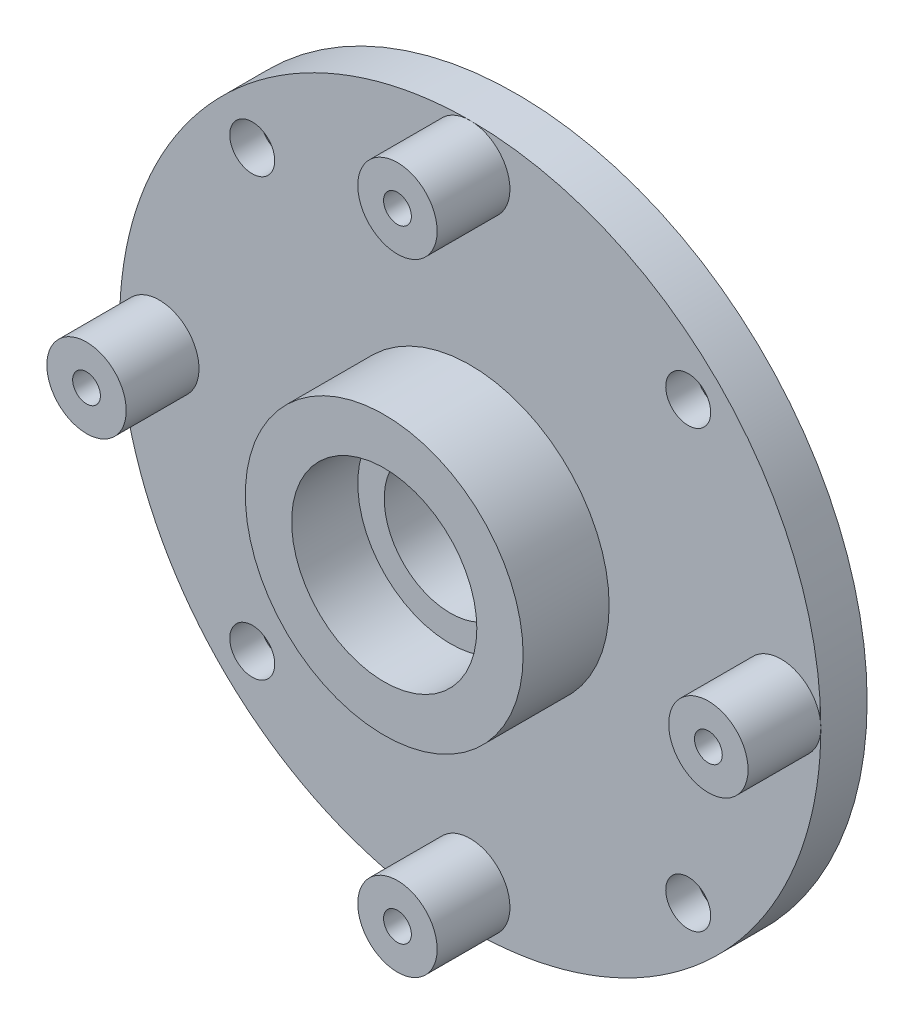
ISO-10303-21;
HEADER;
FILE_DESCRIPTION(('STEP AP214'),'2;1');
FILE_NAME('part.step','',(''),(''),'','','');
FILE_SCHEMA(('AUTOMOTIVE_DESIGN { 1 0 10303 214 1 1 1 1 }'));
ENDSEC;
DATA;
#1=APPLICATION_CONTEXT('core data for automotive mechanical design processes');
#2=APPLICATION_PROTOCOL_DEFINITION('international standard','automotive_design',2000,#1);
#3=PRODUCT_CONTEXT('',#1,'mechanical');
#4=PRODUCT('Part','Part','',(#3));
#5=PRODUCT_RELATED_PRODUCT_CATEGORY('part','',(#4));
#6=PRODUCT_DEFINITION_FORMATION('','',#4);
#7=PRODUCT_DEFINITION_CONTEXT('part definition',#1,'design');
#8=PRODUCT_DEFINITION('design','',#6,#7);
#9=PRODUCT_DEFINITION_SHAPE('','',#8);
#10=(LENGTH_UNIT() NAMED_UNIT(*) SI_UNIT(.MILLI.,.METRE.));
#11=(NAMED_UNIT(*) PLANE_ANGLE_UNIT() SI_UNIT($,.RADIAN.));
#12=(NAMED_UNIT(*) SI_UNIT($,.STERADIAN.) SOLID_ANGLE_UNIT());
#13=UNCERTAINTY_MEASURE_WITH_UNIT(LENGTH_MEASURE(1.E-05),#10,'distance_accuracy_value','');
#14=(GEOMETRIC_REPRESENTATION_CONTEXT(3) GLOBAL_UNCERTAINTY_ASSIGNED_CONTEXT((#13)) GLOBAL_UNIT_ASSIGNED_CONTEXT((#10,
#11,#12)) REPRESENTATION_CONTEXT('',''));
#15=CARTESIAN_POINT('',(0.,0.,0.));
#16=DIRECTION('',(0.,0.,1.));
#17=DIRECTION('',(1.,0.,0.));
#18=AXIS2_PLACEMENT_3D('',#15,#16,#17);
#19=CARTESIAN_POINT('',(0.,0.,-36.7));
#20=DIRECTION('',(0.,0.,-1.));
#21=DIRECTION('',(-1.,0.,0.));
#22=AXIS2_PLACEMENT_3D('',#19,#20,#21);
#23=CYLINDRICAL_SURFACE('',#22,26.5);
#24=CARTESIAN_POINT('',(0.,0.,-36.7));
#25=DIRECTION('',(0.,0.,1.));
#26=DIRECTION('',(1.,0.,0.));
#27=AXIS2_PLACEMENT_3D('',#24,#25,#26);
#28=CIRCLE('',#27,26.5);
#29=CARTESIAN_POINT('',(26.5,0.,-36.7));
#30=VERTEX_POINT('',#29);
#31=CARTESIAN_POINT('',(0.,26.5,-36.7));
#32=VERTEX_POINT('',#31);
#33=EDGE_CURVE('E49',#30,#32,#28,.T.);
#34=ORIENTED_EDGE('',*,*,#33,.F.);
#35=CARTESIAN_POINT('',(0.,-26.5,-36.7));
#36=VERTEX_POINT('',#35);
#37=EDGE_CURVE('E69',#36,#30,#28,.T.);
#38=ORIENTED_EDGE('',*,*,#37,.F.);
#39=CARTESIAN_POINT('',(-26.5,0.,-36.7));
#40=VERTEX_POINT('',#39);
#41=EDGE_CURVE('E78',#40,#36,#28,.T.);
#42=ORIENTED_EDGE('',*,*,#41,.F.);
#43=EDGE_CURVE('E131',#32,#40,#28,.T.);
#44=ORIENTED_EDGE('',*,*,#43,.F.);
#45=EDGE_LOOP('',(#34,#38,#42,#44));
#46=FACE_BOUND('',#45,.T.);
#47=CARTESIAN_POINT('',(0.,0.,-40.2));
#48=DIRECTION('',(0.,0.,1.));
#49=DIRECTION('',(1.,0.,0.));
#50=AXIS2_PLACEMENT_3D('',#47,#48,#49);
#51=CIRCLE('',#50,26.5);
#52=CARTESIAN_POINT('',(26.5,0.,-40.2));
#53=VERTEX_POINT('',#52);
#54=EDGE_CURVE('E79',#53,#53,#51,.T.);
#55=ORIENTED_EDGE('',*,*,#54,.T.);
#56=EDGE_LOOP('',(#55));
#57=FACE_BOUND('',#56,.T.);
#58=ADVANCED_FACE('F41',(#46,#57),#23,.T.);
#59=CARTESIAN_POINT('',(0.,0.,-36.7));
#60=DIRECTION('',(0.,0.,1.));
#61=DIRECTION('',(1.,0.,0.));
#62=AXIS2_PLACEMENT_3D('',#59,#60,#61);
#63=PLANE('',#62);
#64=CARTESIAN_POINT('',(16.4755880016466,-16.4755880016466,-36.7));
#65=DIRECTION('',(0.,0.,1.));
#66=DIRECTION('',(1.,0.,0.));
#67=AXIS2_PLACEMENT_3D('',#64,#65,#66);
#68=CIRCLE('',#67,1.7);
#69=CARTESIAN_POINT('',(18.1755880016466,-16.4755880016466,-36.7));
#70=VERTEX_POINT('',#69);
#71=EDGE_CURVE('E96',#70,#70,#68,.F.);
#72=ORIENTED_EDGE('',*,*,#71,.T.);
#73=EDGE_LOOP('',(#72));
#74=FACE_BOUND('',#73,.T.);
#75=CARTESIAN_POINT('',(-16.4755880016466,-16.4755880016466,-36.7));
#76=DIRECTION('',(0.,0.,1.));
#77=DIRECTION('',(1.,0.,0.));
#78=AXIS2_PLACEMENT_3D('',#75,#76,#77);
#79=CIRCLE('',#78,1.7);
#80=CARTESIAN_POINT('',(-14.7755880016466,-16.4755880016466,-36.7));
#81=VERTEX_POINT('',#80);
#82=EDGE_CURVE('E103',#81,#81,#79,.F.);
#83=ORIENTED_EDGE('',*,*,#82,.T.);
#84=EDGE_LOOP('',(#83));
#85=FACE_BOUND('',#84,.T.);
#86=CARTESIAN_POINT('',(-16.4755880016466,16.4755880016466,-36.7));
#87=DIRECTION('',(0.,0.,1.));
#88=DIRECTION('',(1.,0.,0.));
#89=AXIS2_PLACEMENT_3D('',#86,#87,#88);
#90=CIRCLE('',#89,1.7);
#91=CARTESIAN_POINT('',(-14.7755880016466,16.4755880016466,-36.7));
#92=VERTEX_POINT('',#91);
#93=EDGE_CURVE('E110',#92,#92,#90,.F.);
#94=ORIENTED_EDGE('',*,*,#93,.T.);
#95=EDGE_LOOP('',(#94));
#96=FACE_BOUND('',#95,.T.);
#97=CARTESIAN_POINT('',(16.4755880016469,16.4755880016469,-36.7));
#98=DIRECTION('',(0.,0.,1.));
#99=DIRECTION('',(1.,0.,0.));
#100=AXIS2_PLACEMENT_3D('',#97,#98,#99);
#101=CIRCLE('',#100,1.7);
#102=CARTESIAN_POINT('',(18.1755880016469,16.4755880016469,-36.7));
#103=VERTEX_POINT('',#102);
#104=EDGE_CURVE('E117',#103,#103,#101,.F.);
#105=ORIENTED_EDGE('',*,*,#104,.T.);
#106=EDGE_LOOP('',(#105));
#107=FACE_BOUND('',#106,.T.);
#108=CARTESIAN_POINT('',(0.,0.,-36.7));
#109=DIRECTION('',(0.,0.,1.));
#110=DIRECTION('',(1.,0.,0.));
#111=AXIS2_PLACEMENT_3D('',#108,#109,#110);
#112=CIRCLE('',#111,10.5);
#113=CARTESIAN_POINT('',(10.5,0.,-36.7));
#114=VERTEX_POINT('',#113);
#115=EDGE_CURVE('E11',#114,#114,#112,.T.);
#116=ORIENTED_EDGE('',*,*,#115,.F.);
#117=EDGE_LOOP('',(#116));
#118=FACE_BOUND('',#117,.T.);
#119=ORIENTED_EDGE('',*,*,#41,.T.);
#120=CARTESIAN_POINT('',(0.,-23.5,-36.7));
#121=DIRECTION('',(0.,0.,1.));
#122=DIRECTION('',(1.,0.,0.));
#123=AXIS2_PLACEMENT_3D('',#120,#121,#122);
#124=CIRCLE('',#123,3.);
#125=EDGE_CURVE('E55',#36,#36,#124,.T.);
#126=ORIENTED_EDGE('',*,*,#125,.F.);
#127=ORIENTED_EDGE('',*,*,#37,.T.);
#128=CARTESIAN_POINT('',(23.5,0.,-36.7));
#129=DIRECTION('',(0.,0.,1.));
#130=DIRECTION('',(1.,0.,0.));
#131=AXIS2_PLACEMENT_3D('',#128,#129,#130);
#132=CIRCLE('',#131,3.);
#133=EDGE_CURVE('E74',#30,#30,#132,.T.);
#134=ORIENTED_EDGE('',*,*,#133,.F.);
#135=ORIENTED_EDGE('',*,*,#33,.T.);
#136=CARTESIAN_POINT('',(0.,23.5,-36.7));
#137=DIRECTION('',(0.,0.,1.));
#138=DIRECTION('',(1.,0.,0.));
#139=AXIS2_PLACEMENT_3D('',#136,#137,#138);
#140=CIRCLE('',#139,3.);
#141=EDGE_CURVE('E174',#32,#32,#140,.T.);
#142=ORIENTED_EDGE('',*,*,#141,.F.);
#143=ORIENTED_EDGE('',*,*,#43,.T.);
#144=CARTESIAN_POINT('',(-23.5,0.,-36.7));
#145=DIRECTION('',(0.,0.,1.));
#146=DIRECTION('',(1.,0.,0.));
#147=AXIS2_PLACEMENT_3D('',#144,#145,#146);
#148=CIRCLE('',#147,3.);
#149=EDGE_CURVE('E60',#40,#40,#148,.T.);
#150=ORIENTED_EDGE('',*,*,#149,.F.);
#151=EDGE_LOOP('',(#119,#126,#127,#134,#135,#142,#143,#150));
#152=FACE_BOUND('',#151,.T.);
#153=ADVANCED_FACE('F72',(#74,#85,#96,#107,#118,#152),#63,.T.);
#154=CARTESIAN_POINT('',(0.,0.,-40.2));
#155=DIRECTION('',(0.,0.,1.));
#156=DIRECTION('',(1.,0.,0.));
#157=AXIS2_PLACEMENT_3D('',#154,#155,#156);
#158=PLANE('',#157);
#159=CARTESIAN_POINT('',(0.,-23.5,-40.2));
#160=DIRECTION('',(0.,0.,1.));
#161=DIRECTION('',(1.,0.,0.));
#162=AXIS2_PLACEMENT_3D('',#159,#160,#161);
#163=CIRCLE('',#162,1.05);
#164=CARTESIAN_POINT('',(1.05,-23.5,-40.2));
#165=VERTEX_POINT('',#164);
#166=EDGE_CURVE('E165',#165,#165,#163,.F.);
#167=ORIENTED_EDGE('',*,*,#166,.F.);
#168=EDGE_LOOP('',(#167));
#169=FACE_BOUND('',#168,.T.);
#170=CARTESIAN_POINT('',(-23.5,0.,-40.2));
#171=DIRECTION('',(0.,0.,1.));
#172=DIRECTION('',(1.,0.,0.));
#173=AXIS2_PLACEMENT_3D('',#170,#171,#172);
#174=CIRCLE('',#173,1.05);
#175=CARTESIAN_POINT('',(-22.45,0.,-40.2));
#176=VERTEX_POINT('',#175);
#177=EDGE_CURVE('E155',#176,#176,#174,.F.);
#178=ORIENTED_EDGE('',*,*,#177,.F.);
#179=EDGE_LOOP('',(#178));
#180=FACE_BOUND('',#179,.T.);
#181=CARTESIAN_POINT('',(0.,23.5,-40.2));
#182=DIRECTION('',(0.,0.,1.));
#183=DIRECTION('',(1.,0.,0.));
#184=AXIS2_PLACEMENT_3D('',#181,#182,#183);
#185=CIRCLE('',#184,1.05);
#186=CARTESIAN_POINT('',(1.05,23.5,-40.2));
#187=VERTEX_POINT('',#186);
#188=EDGE_CURVE('E151',#187,#187,#185,.F.);
#189=ORIENTED_EDGE('',*,*,#188,.F.);
#190=EDGE_LOOP('',(#189));
#191=FACE_BOUND('',#190,.T.);
#192=CARTESIAN_POINT('',(23.5,0.,-40.2));
#193=DIRECTION('',(0.,0.,1.));
#194=DIRECTION('',(1.,0.,0.));
#195=AXIS2_PLACEMENT_3D('',#192,#193,#194);
#196=CIRCLE('',#195,1.05);
#197=CARTESIAN_POINT('',(24.55,0.,-40.2));
#198=VERTEX_POINT('',#197);
#199=EDGE_CURVE('E84',#198,#198,#196,.F.);
#200=ORIENTED_EDGE('',*,*,#199,.F.);
#201=EDGE_LOOP('',(#200));
#202=FACE_BOUND('',#201,.T.);
#203=CARTESIAN_POINT('',(16.4755880016469,-16.4755880016469,-40.2));
#204=DIRECTION('',(0.,0.,-1.));
#205=DIRECTION('',(0.,1.,0.));
#206=AXIS2_PLACEMENT_3D('',#203,#204,#205);
#207=CIRCLE('',#206,2.8);
#208=CARTESIAN_POINT('',(16.4755880016469,-13.6755880016469,-40.2));
#209=VERTEX_POINT('',#208);
#210=EDGE_CURVE('E87',#209,#209,#207,.T.);
#211=ORIENTED_EDGE('',*,*,#210,.F.);
#212=EDGE_LOOP('',(#211));
#213=FACE_BOUND('',#212,.T.);
#214=CARTESIAN_POINT('',(-16.4755880016469,-16.4755880016469,-40.2));
#215=DIRECTION('',(0.,0.,-1.));
#216=DIRECTION('',(0.,1.,0.));
#217=AXIS2_PLACEMENT_3D('',#214,#215,#216);
#218=CIRCLE('',#217,2.8);
#219=CARTESIAN_POINT('',(-16.4755880016469,-13.6755880016469,-40.2));
#220=VERTEX_POINT('',#219);
#221=EDGE_CURVE('E99',#220,#220,#218,.T.);
#222=ORIENTED_EDGE('',*,*,#221,.F.);
#223=EDGE_LOOP('',(#222));
#224=FACE_BOUND('',#223,.T.);
#225=CARTESIAN_POINT('',(-16.4755880016469,16.4755880016469,-40.2));
#226=DIRECTION('',(0.,0.,-1.));
#227=DIRECTION('',(0.,1.,0.));
#228=AXIS2_PLACEMENT_3D('',#225,#226,#227);
#229=CIRCLE('',#228,2.8);
#230=CARTESIAN_POINT('',(-16.4755880016469,19.2755880016469,-40.2));
#231=VERTEX_POINT('',#230);
#232=EDGE_CURVE('E106',#231,#231,#229,.T.);
#233=ORIENTED_EDGE('',*,*,#232,.F.);
#234=EDGE_LOOP('',(#233));
#235=FACE_BOUND('',#234,.T.);
#236=CARTESIAN_POINT('',(16.4755880016469,16.4755880016469,-40.2));
#237=DIRECTION('',(0.,0.,-1.));
#238=DIRECTION('',(0.,1.,0.));
#239=AXIS2_PLACEMENT_3D('',#236,#237,#238);
#240=CIRCLE('',#239,2.8);
#241=CARTESIAN_POINT('',(16.4755880016469,19.2755880016469,-40.2));
#242=VERTEX_POINT('',#241);
#243=EDGE_CURVE('E113',#242,#242,#240,.T.);
#244=ORIENTED_EDGE('',*,*,#243,.F.);
#245=EDGE_LOOP('',(#244));
#246=FACE_BOUND('',#245,.T.);
#247=CARTESIAN_POINT('',(0.,0.,-40.2));
#248=DIRECTION('',(0.,0.,1.));
#249=DIRECTION('',(1.,0.,0.));
#250=AXIS2_PLACEMENT_3D('',#247,#248,#249);
#251=CIRCLE('',#250,5.);
#252=CARTESIAN_POINT('',(5.,0.,-40.2));
#253=VERTEX_POINT('',#252);
#254=EDGE_CURVE('E123',#253,#253,#251,.F.);
#255=ORIENTED_EDGE('',*,*,#254,.F.);
#256=EDGE_LOOP('',(#255));
#257=FACE_BOUND('',#256,.T.);
#258=ORIENTED_EDGE('',*,*,#54,.F.);
#259=EDGE_LOOP('',(#258));
#260=FACE_BOUND('',#259,.T.);
#261=ADVANCED_FACE('F186',(#169,#180,#191,#202,#213,#224,#235,#246,#257,#260),#158,.F.);
#262=CARTESIAN_POINT('',(0.,0.,-30.2));
#263=DIRECTION('',(0.,0.,-1.));
#264=DIRECTION('',(-1.,0.,0.));
#265=AXIS2_PLACEMENT_3D('',#262,#263,#264);
#266=CYLINDRICAL_SURFACE('',#265,10.5);
#267=CARTESIAN_POINT('',(0.,0.,-30.2));
#268=DIRECTION('',(0.,0.,1.));
#269=DIRECTION('',(1.,0.,0.));
#270=AXIS2_PLACEMENT_3D('',#267,#268,#269);
#271=CIRCLE('',#270,10.5);
#272=CARTESIAN_POINT('',(10.5,0.,-30.2));
#273=VERTEX_POINT('',#272);
#274=EDGE_CURVE('E128',#273,#273,#271,.T.);
#275=ORIENTED_EDGE('',*,*,#274,.F.);
#276=EDGE_LOOP('',(#275));
#277=FACE_BOUND('',#276,.T.);
#278=ORIENTED_EDGE('',*,*,#115,.T.);
#279=EDGE_LOOP('',(#278));
#280=FACE_BOUND('',#279,.T.);
#281=ADVANCED_FACE('F188',(#277,#280),#266,.T.);
#282=CARTESIAN_POINT('',(0.,0.,-30.2));
#283=DIRECTION('',(0.,0.,1.));
#284=DIRECTION('',(1.,0.,0.));
#285=AXIS2_PLACEMENT_3D('',#282,#283,#284);
#286=PLANE('',#285);
#287=CARTESIAN_POINT('',(0.,0.,-30.2));
#288=DIRECTION('',(0.,0.,1.));
#289=DIRECTION('',(1.,0.,0.));
#290=AXIS2_PLACEMENT_3D('',#287,#288,#289);
#291=CIRCLE('',#290,7.);
#292=CARTESIAN_POINT('',(7.,0.,-30.2));
#293=VERTEX_POINT('',#292);
#294=EDGE_CURVE('E127',#293,#293,#291,.F.);
#295=ORIENTED_EDGE('',*,*,#294,.T.);
#296=EDGE_LOOP('',(#295));
#297=FACE_BOUND('',#296,.T.);
#298=ORIENTED_EDGE('',*,*,#274,.T.);
#299=EDGE_LOOP('',(#298));
#300=FACE_BOUND('',#299,.T.);
#301=ADVANCED_FACE('F194',(#297,#300),#286,.T.);
#302=CARTESIAN_POINT('',(0.,0.,-30.1));
#303=DIRECTION('',(0.,0.,-1.));
#304=DIRECTION('',(-1.,0.,0.));
#305=AXIS2_PLACEMENT_3D('',#302,#303,#304);
#306=CYLINDRICAL_SURFACE('',#305,7.);
#307=ORIENTED_EDGE('',*,*,#294,.F.);
#308=EDGE_LOOP('',(#307));
#309=FACE_BOUND('',#308,.T.);
#310=CARTESIAN_POINT('',(0.,0.,-35.2));
#311=DIRECTION('',(0.,0.,1.));
#312=DIRECTION('',(1.,0.,0.));
#313=AXIS2_PLACEMENT_3D('',#310,#311,#312);
#314=CIRCLE('',#313,7.);
#315=CARTESIAN_POINT('',(7.,0.,-35.2));
#316=VERTEX_POINT('',#315);
#317=EDGE_CURVE('E124',#316,#316,#314,.T.);
#318=ORIENTED_EDGE('',*,*,#317,.F.);
#319=EDGE_LOOP('',(#318));
#320=FACE_BOUND('',#319,.T.);
#321=ADVANCED_FACE('F204',(#309,#320),#306,.F.);
#322=CARTESIAN_POINT('',(0.,0.,-35.2));
#323=DIRECTION('',(0.,0.,1.));
#324=DIRECTION('',(1.,0.,0.));
#325=AXIS2_PLACEMENT_3D('',#322,#323,#324);
#326=PLANE('',#325);
#327=CARTESIAN_POINT('',(0.,0.,-35.2));
#328=DIRECTION('',(0.,0.,1.));
#329=DIRECTION('',(1.,0.,0.));
#330=AXIS2_PLACEMENT_3D('',#327,#328,#329);
#331=CIRCLE('',#330,5.);
#332=CARTESIAN_POINT('',(5.,0.,-35.2));
#333=VERTEX_POINT('',#332);
#334=EDGE_CURVE('E120',#333,#333,#331,.T.);
#335=ORIENTED_EDGE('',*,*,#334,.F.);
#336=EDGE_LOOP('',(#335));
#337=FACE_BOUND('',#336,.T.);
#338=ORIENTED_EDGE('',*,*,#317,.T.);
#339=EDGE_LOOP('',(#338));
#340=FACE_BOUND('',#339,.T.);
#341=ADVANCED_FACE('F208',(#337,#340),#326,.T.);
#342=CARTESIAN_POINT('',(0.,0.,-35.2));
#343=DIRECTION('',(0.,0.,-1.));
#344=DIRECTION('',(-1.,0.,0.));
#345=AXIS2_PLACEMENT_3D('',#342,#343,#344);
#346=CYLINDRICAL_SURFACE('',#345,5.);
#347=ORIENTED_EDGE('',*,*,#334,.T.);
#348=EDGE_LOOP('',(#347));
#349=FACE_BOUND('',#348,.T.);
#350=ORIENTED_EDGE('',*,*,#254,.T.);
#351=EDGE_LOOP('',(#350));
#352=FACE_BOUND('',#351,.T.);
#353=ADVANCED_FACE('F212',(#349,#352),#346,.F.);
#354=CARTESIAN_POINT('',(16.4755880016469,16.4755880016469,-36.3));
#355=DIRECTION('',(0.,0.,-1.));
#356=DIRECTION('',(-1.,0.,0.));
#357=AXIS2_PLACEMENT_3D('',#354,#355,#356);
#358=CYLINDRICAL_SURFACE('',#357,1.7);
#359=CARTESIAN_POINT('',(16.4755880016469,16.4755880016469,-39.0290322580645));
#360=DIRECTION('',(0.,0.,-1.));
#361=DIRECTION('',(0.,1.,0.));
#362=AXIS2_PLACEMENT_3D('',#359,#360,#361);
#363=CIRCLE('',#362,1.7);
#364=CARTESIAN_POINT('',(16.4755880016469,18.1755880016469,-39.0290322580645));
#365=VERTEX_POINT('',#364);
#366=EDGE_CURVE('E116',#365,#365,#363,.F.);
#367=ORIENTED_EDGE('',*,*,#366,.F.);
#368=EDGE_LOOP('',(#367));
#369=FACE_BOUND('',#368,.T.);
#370=ORIENTED_EDGE('',*,*,#104,.F.);
#371=EDGE_LOOP('',(#370));
#372=FACE_BOUND('',#371,.T.);
#373=ADVANCED_FACE('F216',(#369,#372),#358,.F.);
#374=CARTESIAN_POINT('',(16.4755880016469,16.4755880016469,-40.2));
#375=DIRECTION('',(0.,0.,-1.));
#376=DIRECTION('',(0.,1.,0.));
#377=AXIS2_PLACEMENT_3D('',#374,#375,#376);
#378=CONICAL_SURFACE('',#377,2.8,0.75415832996718);
#379=ORIENTED_EDGE('',*,*,#366,.T.);
#380=EDGE_LOOP('',(#379));
#381=FACE_BOUND('',#380,.T.);
#382=ORIENTED_EDGE('',*,*,#243,.T.);
#383=EDGE_LOOP('',(#382));
#384=FACE_BOUND('',#383,.T.);
#385=ADVANCED_FACE('F220',(#381,#384),#378,.F.);
#386=CARTESIAN_POINT('',(-16.4755880016466,16.4755880016466,-36.3));
#387=DIRECTION('',(0.,0.,-1.));
#388=DIRECTION('',(-1.,0.,0.));
#389=AXIS2_PLACEMENT_3D('',#386,#387,#388);
#390=CYLINDRICAL_SURFACE('',#389,1.7);
#391=CARTESIAN_POINT('',(-16.4755880016469,16.4755880016469,-39.0290322580645));
#392=DIRECTION('',(0.,0.,-1.));
#393=DIRECTION('',(0.,1.,0.));
#394=AXIS2_PLACEMENT_3D('',#391,#392,#393);
#395=CIRCLE('',#394,1.7);
#396=CARTESIAN_POINT('',(-16.4755880016469,18.1755880016469,-39.0290322580645));
#397=VERTEX_POINT('',#396);
#398=EDGE_CURVE('E109',#397,#397,#395,.F.);
#399=ORIENTED_EDGE('',*,*,#398,.F.);
#400=EDGE_LOOP('',(#399));
#401=FACE_BOUND('',#400,.T.);
#402=ORIENTED_EDGE('',*,*,#93,.F.);
#403=EDGE_LOOP('',(#402));
#404=FACE_BOUND('',#403,.T.);
#405=ADVANCED_FACE('F224',(#401,#404),#390,.F.);
#406=CARTESIAN_POINT('',(-16.4755880016469,16.4755880016469,-40.2));
#407=DIRECTION('',(0.,0.,-1.));
#408=DIRECTION('',(0.,1.,0.));
#409=AXIS2_PLACEMENT_3D('',#406,#407,#408);
#410=CONICAL_SURFACE('',#409,2.8,0.75415832996718);
#411=ORIENTED_EDGE('',*,*,#398,.T.);
#412=EDGE_LOOP('',(#411));
#413=FACE_BOUND('',#412,.T.);
#414=ORIENTED_EDGE('',*,*,#232,.T.);
#415=EDGE_LOOP('',(#414));
#416=FACE_BOUND('',#415,.T.);
#417=ADVANCED_FACE('F228',(#413,#416),#410,.F.);
#418=CARTESIAN_POINT('',(-16.4755880016466,-16.4755880016466,-36.3));
#419=DIRECTION('',(0.,0.,-1.));
#420=DIRECTION('',(-1.,0.,0.));
#421=AXIS2_PLACEMENT_3D('',#418,#419,#420);
#422=CYLINDRICAL_SURFACE('',#421,1.7);
#423=CARTESIAN_POINT('',(-16.4755880016469,-16.4755880016469,-39.0290322580645));
#424=DIRECTION('',(0.,0.,-1.));
#425=DIRECTION('',(0.,1.,0.));
#426=AXIS2_PLACEMENT_3D('',#423,#424,#425);
#427=CIRCLE('',#426,1.7);
#428=CARTESIAN_POINT('',(-16.4755880016469,-14.7755880016469,-39.0290322580645));
#429=VERTEX_POINT('',#428);
#430=EDGE_CURVE('E102',#429,#429,#427,.F.);
#431=ORIENTED_EDGE('',*,*,#430,.F.);
#432=EDGE_LOOP('',(#431));
#433=FACE_BOUND('',#432,.T.);
#434=ORIENTED_EDGE('',*,*,#82,.F.);
#435=EDGE_LOOP('',(#434));
#436=FACE_BOUND('',#435,.T.);
#437=ADVANCED_FACE('F232',(#433,#436),#422,.F.);
#438=CARTESIAN_POINT('',(-16.4755880016469,-16.4755880016469,-40.2));
#439=DIRECTION('',(0.,0.,-1.));
#440=DIRECTION('',(0.,1.,0.));
#441=AXIS2_PLACEMENT_3D('',#438,#439,#440);
#442=CONICAL_SURFACE('',#441,2.8,0.75415832996718);
#443=ORIENTED_EDGE('',*,*,#430,.T.);
#444=EDGE_LOOP('',(#443));
#445=FACE_BOUND('',#444,.T.);
#446=ORIENTED_EDGE('',*,*,#221,.T.);
#447=EDGE_LOOP('',(#446));
#448=FACE_BOUND('',#447,.T.);
#449=ADVANCED_FACE('F236',(#445,#448),#442,.F.);
#450=CARTESIAN_POINT('',(16.4755880016466,-16.4755880016466,-36.3));
#451=DIRECTION('',(0.,0.,-1.));
#452=DIRECTION('',(-1.,0.,0.));
#453=AXIS2_PLACEMENT_3D('',#450,#451,#452);
#454=CYLINDRICAL_SURFACE('',#453,1.7);
#455=CARTESIAN_POINT('',(16.4755880016469,-16.4755880016469,-39.0290322580645));
#456=DIRECTION('',(0.,0.,-1.));
#457=DIRECTION('',(0.,1.,0.));
#458=AXIS2_PLACEMENT_3D('',#455,#456,#457);
#459=CIRCLE('',#458,1.7);
#460=CARTESIAN_POINT('',(16.4755880016469,-14.7755880016469,-39.0290322580645));
#461=VERTEX_POINT('',#460);
#462=EDGE_CURVE('E95',#461,#461,#459,.F.);
#463=ORIENTED_EDGE('',*,*,#462,.F.);
#464=EDGE_LOOP('',(#463));
#465=FACE_BOUND('',#464,.T.);
#466=ORIENTED_EDGE('',*,*,#71,.F.);
#467=EDGE_LOOP('',(#466));
#468=FACE_BOUND('',#467,.T.);
#469=ADVANCED_FACE('F240',(#465,#468),#454,.F.);
#470=CARTESIAN_POINT('',(16.4755880016469,-16.4755880016469,-40.2));
#471=DIRECTION('',(0.,0.,-1.));
#472=DIRECTION('',(0.,1.,0.));
#473=AXIS2_PLACEMENT_3D('',#470,#471,#472);
#474=CONICAL_SURFACE('',#473,2.8,0.75415832996718);
#475=ORIENTED_EDGE('',*,*,#462,.T.);
#476=EDGE_LOOP('',(#475));
#477=FACE_BOUND('',#476,.T.);
#478=ORIENTED_EDGE('',*,*,#210,.T.);
#479=EDGE_LOOP('',(#478));
#480=FACE_BOUND('',#479,.T.);
#481=ADVANCED_FACE('F244',(#477,#480),#474,.F.);
#482=CARTESIAN_POINT('',(23.5,0.,-31.2));
#483=DIRECTION('',(0.,0.,-1.));
#484=DIRECTION('',(-1.,0.,0.));
#485=AXIS2_PLACEMENT_3D('',#482,#483,#484);
#486=CYLINDRICAL_SURFACE('',#485,3.);
#487=CARTESIAN_POINT('',(23.5,0.,-31.2));
#488=DIRECTION('',(0.,0.,1.));
#489=DIRECTION('',(1.,0.,0.));
#490=AXIS2_PLACEMENT_3D('',#487,#488,#489);
#491=CIRCLE('',#490,3.);
#492=CARTESIAN_POINT('',(26.5,0.,-31.2));
#493=VERTEX_POINT('',#492);
#494=EDGE_CURVE('E83',#493,#493,#491,.T.);
#495=ORIENTED_EDGE('',*,*,#494,.F.);
#496=EDGE_LOOP('',(#495));
#497=FACE_BOUND('',#496,.T.);
#498=ORIENTED_EDGE('',*,*,#133,.T.);
#499=EDGE_LOOP('',(#498));
#500=FACE_BOUND('',#499,.T.);
#501=ADVANCED_FACE('F82',(#497,#500),#486,.T.);
#502=CARTESIAN_POINT('',(23.5,0.,-31.2));
#503=DIRECTION('',(0.,0.,1.));
#504=DIRECTION('',(1.,0.,0.));
#505=AXIS2_PLACEMENT_3D('',#502,#503,#504);
#506=PLANE('',#505);
#507=CARTESIAN_POINT('',(23.5,0.,-31.2));
#508=DIRECTION('',(0.,0.,1.));
#509=DIRECTION('',(1.,0.,0.));
#510=AXIS2_PLACEMENT_3D('',#507,#508,#509);
#511=CIRCLE('',#510,1.05);
#512=CARTESIAN_POINT('',(24.55,0.,-31.2));
#513=VERTEX_POINT('',#512);
#514=EDGE_CURVE('E90',#513,#513,#511,.F.);
#515=ORIENTED_EDGE('',*,*,#514,.T.);
#516=EDGE_LOOP('',(#515));
#517=FACE_BOUND('',#516,.T.);
#518=ORIENTED_EDGE('',*,*,#494,.T.);
#519=EDGE_LOOP('',(#518));
#520=FACE_BOUND('',#519,.T.);
#521=ADVANCED_FACE('F251',(#517,#520),#506,.T.);
#522=CARTESIAN_POINT('',(23.5,0.,-31.11));
#523=DIRECTION('',(0.,0.,-1.));
#524=DIRECTION('',(-1.,0.,0.));
#525=AXIS2_PLACEMENT_3D('',#522,#523,#524);
#526=CYLINDRICAL_SURFACE('',#525,1.05);
#527=ORIENTED_EDGE('',*,*,#514,.F.);
#528=EDGE_LOOP('',(#527));
#529=FACE_BOUND('',#528,.T.);
#530=ORIENTED_EDGE('',*,*,#199,.T.);
#531=EDGE_LOOP('',(#530));
#532=FACE_BOUND('',#531,.T.);
#533=ADVANCED_FACE('F255',(#529,#532),#526,.F.);
#534=CARTESIAN_POINT('',(0.,23.5,-31.2));
#535=DIRECTION('',(0.,0.,-1.));
#536=DIRECTION('',(-1.,0.,0.));
#537=AXIS2_PLACEMENT_3D('',#534,#535,#536);
#538=CYLINDRICAL_SURFACE('',#537,3.);
#539=CARTESIAN_POINT('',(0.,23.5,-31.2));
#540=DIRECTION('',(0.,0.,1.));
#541=DIRECTION('',(1.,0.,0.));
#542=AXIS2_PLACEMENT_3D('',#539,#540,#541);
#543=CIRCLE('',#542,3.);
#544=CARTESIAN_POINT('',(3.,23.5,-31.2));
#545=VERTEX_POINT('',#544);
#546=EDGE_CURVE('E148',#545,#545,#543,.T.);
#547=ORIENTED_EDGE('',*,*,#546,.F.);
#548=EDGE_LOOP('',(#547));
#549=FACE_BOUND('',#548,.T.);
#550=ORIENTED_EDGE('',*,*,#141,.T.);
#551=EDGE_LOOP('',(#550));
#552=FACE_BOUND('',#551,.T.);
#553=ADVANCED_FACE('F179',(#549,#552),#538,.T.);
#554=CARTESIAN_POINT('',(0.,23.5,-31.2));
#555=DIRECTION('',(0.,0.,1.));
#556=DIRECTION('',(1.,0.,0.));
#557=AXIS2_PLACEMENT_3D('',#554,#555,#556);
#558=PLANE('',#557);
#559=CARTESIAN_POINT('',(0.,23.5,-31.2));
#560=DIRECTION('',(0.,0.,1.));
#561=DIRECTION('',(1.,0.,0.));
#562=AXIS2_PLACEMENT_3D('',#559,#560,#561);
#563=CIRCLE('',#562,1.05);
#564=CARTESIAN_POINT('',(1.05,23.5,-31.2));
#565=VERTEX_POINT('',#564);
#566=EDGE_CURVE('E149',#565,#565,#563,.F.);
#567=ORIENTED_EDGE('',*,*,#566,.T.);
#568=EDGE_LOOP('',(#567));
#569=FACE_BOUND('',#568,.T.);
#570=ORIENTED_EDGE('',*,*,#546,.T.);
#571=EDGE_LOOP('',(#570));
#572=FACE_BOUND('',#571,.T.);
#573=ADVANCED_FACE('F262',(#569,#572),#558,.T.);
#574=CARTESIAN_POINT('',(0.,23.5,-31.11));
#575=DIRECTION('',(0.,0.,-1.));
#576=DIRECTION('',(-1.,0.,0.));
#577=AXIS2_PLACEMENT_3D('',#574,#575,#576);
#578=CYLINDRICAL_SURFACE('',#577,1.05);
#579=ORIENTED_EDGE('',*,*,#566,.F.);
#580=EDGE_LOOP('',(#579));
#581=FACE_BOUND('',#580,.T.);
#582=ORIENTED_EDGE('',*,*,#188,.T.);
#583=EDGE_LOOP('',(#582));
#584=FACE_BOUND('',#583,.T.);
#585=ADVANCED_FACE('F266',(#581,#584),#578,.F.);
#586=CARTESIAN_POINT('',(-23.5,0.,-31.2));
#587=DIRECTION('',(0.,0.,-1.));
#588=DIRECTION('',(-1.,0.,0.));
#589=AXIS2_PLACEMENT_3D('',#586,#587,#588);
#590=CYLINDRICAL_SURFACE('',#589,3.);
#591=CARTESIAN_POINT('',(-23.5,0.,-31.2));
#592=DIRECTION('',(0.,0.,1.));
#593=DIRECTION('',(1.,0.,0.));
#594=AXIS2_PLACEMENT_3D('',#591,#592,#593);
#595=CIRCLE('',#594,3.);
#596=CARTESIAN_POINT('',(-20.5,0.,-31.2));
#597=VERTEX_POINT('',#596);
#598=EDGE_CURVE('E152',#597,#597,#595,.T.);
#599=ORIENTED_EDGE('',*,*,#598,.F.);
#600=EDGE_LOOP('',(#599));
#601=FACE_BOUND('',#600,.T.);
#602=ORIENTED_EDGE('',*,*,#149,.T.);
#603=EDGE_LOOP('',(#602));
#604=FACE_BOUND('',#603,.T.);
#605=ADVANCED_FACE('F270',(#601,#604),#590,.T.);
#606=CARTESIAN_POINT('',(-23.5,0.,-31.2));
#607=DIRECTION('',(0.,0.,1.));
#608=DIRECTION('',(1.,0.,0.));
#609=AXIS2_PLACEMENT_3D('',#606,#607,#608);
#610=PLANE('',#609);
#611=CARTESIAN_POINT('',(-23.5,0.,-31.2));
#612=DIRECTION('',(0.,0.,1.));
#613=DIRECTION('',(1.,0.,0.));
#614=AXIS2_PLACEMENT_3D('',#611,#612,#613);
#615=CIRCLE('',#614,1.05);
#616=CARTESIAN_POINT('',(-22.45,0.,-31.2));
#617=VERTEX_POINT('',#616);
#618=EDGE_CURVE('E153',#617,#617,#615,.F.);
#619=ORIENTED_EDGE('',*,*,#618,.T.);
#620=EDGE_LOOP('',(#619));
#621=FACE_BOUND('',#620,.T.);
#622=ORIENTED_EDGE('',*,*,#598,.T.);
#623=EDGE_LOOP('',(#622));
#624=FACE_BOUND('',#623,.T.);
#625=ADVANCED_FACE('F274',(#621,#624),#610,.T.);
#626=CARTESIAN_POINT('',(-23.5,0.,-31.11));
#627=DIRECTION('',(0.,0.,-1.));
#628=DIRECTION('',(-1.,0.,0.));
#629=AXIS2_PLACEMENT_3D('',#626,#627,#628);
#630=CYLINDRICAL_SURFACE('',#629,1.05);
#631=ORIENTED_EDGE('',*,*,#618,.F.);
#632=EDGE_LOOP('',(#631));
#633=FACE_BOUND('',#632,.T.);
#634=ORIENTED_EDGE('',*,*,#177,.T.);
#635=EDGE_LOOP('',(#634));
#636=FACE_BOUND('',#635,.T.);
#637=ADVANCED_FACE('F278',(#633,#636),#630,.F.);
#638=CARTESIAN_POINT('',(0.,-23.5,-31.2));
#639=DIRECTION('',(0.,0.,-1.));
#640=DIRECTION('',(-1.,0.,0.));
#641=AXIS2_PLACEMENT_3D('',#638,#639,#640);
#642=CYLINDRICAL_SURFACE('',#641,3.);
#643=CARTESIAN_POINT('',(0.,-23.5,-31.2));
#644=DIRECTION('',(0.,0.,1.));
#645=DIRECTION('',(1.,0.,0.));
#646=AXIS2_PLACEMENT_3D('',#643,#644,#645);
#647=CIRCLE('',#646,3.);
#648=CARTESIAN_POINT('',(3.,-23.5,-31.2));
#649=VERTEX_POINT('',#648);
#650=EDGE_CURVE('E156',#649,#649,#647,.T.);
#651=ORIENTED_EDGE('',*,*,#650,.F.);
#652=EDGE_LOOP('',(#651));
#653=FACE_BOUND('',#652,.T.);
#654=ORIENTED_EDGE('',*,*,#125,.T.);
#655=EDGE_LOOP('',(#654));
#656=FACE_BOUND('',#655,.T.);
#657=ADVANCED_FACE('F281',(#653,#656),#642,.T.);
#658=CARTESIAN_POINT('',(0.,-23.5,-31.2));
#659=DIRECTION('',(0.,0.,1.));
#660=DIRECTION('',(1.,0.,0.));
#661=AXIS2_PLACEMENT_3D('',#658,#659,#660);
#662=PLANE('',#661);
#663=CARTESIAN_POINT('',(0.,-23.5,-31.2));
#664=DIRECTION('',(0.,0.,1.));
#665=DIRECTION('',(1.,0.,0.));
#666=AXIS2_PLACEMENT_3D('',#663,#664,#665);
#667=CIRCLE('',#666,1.05);
#668=CARTESIAN_POINT('',(1.05,-23.5,-31.2));
#669=VERTEX_POINT('',#668);
#670=EDGE_CURVE('E44',#669,#669,#667,.F.);
#671=ORIENTED_EDGE('',*,*,#670,.T.);
#672=EDGE_LOOP('',(#671));
#673=FACE_BOUND('',#672,.T.);
#674=ORIENTED_EDGE('',*,*,#650,.T.);
#675=EDGE_LOOP('',(#674));
#676=FACE_BOUND('',#675,.T.);
#677=ADVANCED_FACE('F285',(#673,#676),#662,.T.);
#678=CARTESIAN_POINT('',(0.,-23.5,-31.11));
#679=DIRECTION('',(0.,0.,-1.));
#680=DIRECTION('',(-1.,0.,0.));
#681=AXIS2_PLACEMENT_3D('',#678,#679,#680);
#682=CYLINDRICAL_SURFACE('',#681,1.05);
#683=ORIENTED_EDGE('',*,*,#670,.F.);
#684=EDGE_LOOP('',(#683));
#685=FACE_BOUND('',#684,.T.);
#686=ORIENTED_EDGE('',*,*,#166,.T.);
#687=EDGE_LOOP('',(#686));
#688=FACE_BOUND('',#687,.T.);
#689=ADVANCED_FACE('F289',(#685,#688),#682,.F.);
#690=CLOSED_SHELL('',(#58,#153,#261,#281,#301,#321,#341,#353,#373,#385,#405,#417,#437,#449,#469,
#481,#501,#521,#533,#553,#573,#585,#605,#625,#637,#657,#677,#689));
#691=MANIFOLD_SOLID_BREP('B2',#690);
#692=ADVANCED_BREP_SHAPE_REPRESENTATION('',(#18,#691),#14);
#693=SHAPE_DEFINITION_REPRESENTATION(#9,#692);
ENDSEC;
END-ISO-10303-21;
